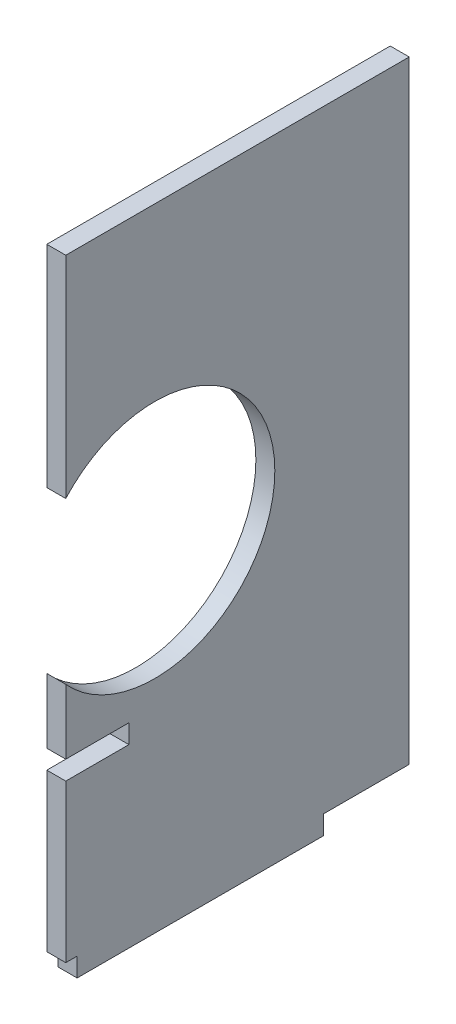
ISO-10303-21;
HEADER;
FILE_DESCRIPTION(('STEP AP214'),'2;1');
FILE_NAME('part.step','',(''),(''),'','','');
FILE_SCHEMA(('AUTOMOTIVE_DESIGN { 1 0 10303 214 1 1 1 1 }'));
ENDSEC;
DATA;
#1=APPLICATION_CONTEXT('core data for automotive mechanical design processes');
#2=APPLICATION_PROTOCOL_DEFINITION('international standard','automotive_design',2000,#1);
#3=PRODUCT_CONTEXT('',#1,'mechanical');
#4=PRODUCT('Part','Part','',(#3));
#5=PRODUCT_RELATED_PRODUCT_CATEGORY('part','',(#4));
#6=PRODUCT_DEFINITION_FORMATION('','',#4);
#7=PRODUCT_DEFINITION_CONTEXT('part definition',#1,'design');
#8=PRODUCT_DEFINITION('design','',#6,#7);
#9=PRODUCT_DEFINITION_SHAPE('','',#8);
#10=(LENGTH_UNIT() NAMED_UNIT(*) SI_UNIT(.MILLI.,.METRE.));
#11=(NAMED_UNIT(*) PLANE_ANGLE_UNIT() SI_UNIT($,.RADIAN.));
#12=(NAMED_UNIT(*) SI_UNIT($,.STERADIAN.) SOLID_ANGLE_UNIT());
#13=UNCERTAINTY_MEASURE_WITH_UNIT(LENGTH_MEASURE(1.E-05),#10,'distance_accuracy_value','');
#14=(GEOMETRIC_REPRESENTATION_CONTEXT(3) GLOBAL_UNCERTAINTY_ASSIGNED_CONTEXT((#13)) GLOBAL_UNIT_ASSIGNED_CONTEXT((#10,
#11,#12)) REPRESENTATION_CONTEXT('',''));
#15=CARTESIAN_POINT('',(0.,0.,0.));
#16=DIRECTION('',(0.,0.,1.));
#17=DIRECTION('',(1.,0.,0.));
#18=AXIS2_PLACEMENT_3D('',#15,#16,#17);
#19=CARTESIAN_POINT('',(0.,-106.426547116313,5.10565550545121));
#20=DIRECTION('',(0.,0.,-1.));
#21=DIRECTION('',(0.,1.,0.));
#22=AXIS2_PLACEMENT_3D('',#19,#20,#21);
#23=PLANE('',#22);
#24=DIRECTION('',(0.,1.,0.));
#25=VECTOR('',#24,1.);
#26=CARTESIAN_POINT('',(3.,-106.426547116313,5.10565550545121));
#27=LINE('',#26,#25);
#28=CARTESIAN_POINT('',(3.,-106.426547116313,5.10565550545121));
#29=VERTEX_POINT('',#28);
#30=CARTESIAN_POINT('',(3.,-9.42654711631268,5.10565550545122));
#31=VERTEX_POINT('',#30);
#32=EDGE_CURVE('E166',#29,#31,#27,.T.);
#33=ORIENTED_EDGE('',*,*,#32,.F.);
#34=DIRECTION('',(1.,0.,0.));
#35=VECTOR('',#34,1.);
#36=CARTESIAN_POINT('',(0.,-106.426547116313,5.10565550545121));
#37=LINE('',#36,#35);
#38=CARTESIAN_POINT('',(0.,-106.426547116313,5.10565550545121));
#39=VERTEX_POINT('',#38);
#40=EDGE_CURVE('E11',#39,#29,#37,.T.);
#41=ORIENTED_EDGE('',*,*,#40,.F.);
#42=DIRECTION('',(0.,1.,0.));
#43=VECTOR('',#42,1.);
#44=CARTESIAN_POINT('',(0.,-106.426547116313,5.10565550545121));
#45=LINE('',#44,#43);
#46=CARTESIAN_POINT('',(0.,-9.42654711631268,5.10565550545122));
#47=VERTEX_POINT('',#46);
#48=EDGE_CURVE('E204',#39,#47,#45,.T.);
#49=ORIENTED_EDGE('',*,*,#48,.T.);
#50=DIRECTION('',(1.,0.,0.));
#51=VECTOR('',#50,1.);
#52=CARTESIAN_POINT('',(0.,-9.42654711631268,5.10565550545122));
#53=LINE('',#52,#51);
#54=EDGE_CURVE('E36',#47,#31,#53,.T.);
#55=ORIENTED_EDGE('',*,*,#54,.T.);
#56=EDGE_LOOP('',(#33,#41,#49,#55));
#57=FACE_BOUND('',#56,.T.);
#58=ADVANCED_FACE('F33',(#57),#23,.T.);
#59=CARTESIAN_POINT('',(0.,-106.426547116313,18.6756555054512));
#60=DIRECTION('',(0.,-1.,0.));
#61=DIRECTION('',(0.,0.,-1.));
#62=AXIS2_PLACEMENT_3D('',#59,#60,#61);
#63=PLANE('',#62);
#64=DIRECTION('',(0.,0.,-1.));
#65=VECTOR('',#64,1.);
#66=CARTESIAN_POINT('',(3.,-106.426547116313,18.6756555054512));
#67=LINE('',#66,#65);
#68=CARTESIAN_POINT('',(3.,-106.426547116313,18.6756555054512));
#69=VERTEX_POINT('',#68);
#70=EDGE_CURVE('E202',#69,#29,#67,.T.);
#71=ORIENTED_EDGE('',*,*,#70,.F.);
#72=DIRECTION('',(1.,0.,0.));
#73=VECTOR('',#72,1.);
#74=CARTESIAN_POINT('',(0.,-106.426547116313,18.6756555054512));
#75=LINE('',#74,#73);
#76=CARTESIAN_POINT('',(0.,-106.426547116313,18.6756555054512));
#77=VERTEX_POINT('',#76);
#78=EDGE_CURVE('E42',#77,#69,#75,.T.);
#79=ORIENTED_EDGE('',*,*,#78,.F.);
#80=DIRECTION('',(0.,0.,-1.));
#81=VECTOR('',#80,1.);
#82=CARTESIAN_POINT('',(0.,-106.426547116313,18.6756555054512));
#83=LINE('',#82,#81);
#84=EDGE_CURVE('E156',#77,#39,#83,.T.);
#85=ORIENTED_EDGE('',*,*,#84,.T.);
#86=ORIENTED_EDGE('',*,*,#40,.T.);
#87=EDGE_LOOP('',(#71,#79,#85,#86));
#88=FACE_BOUND('',#87,.T.);
#89=ADVANCED_FACE('F228',(#88),#63,.T.);
#90=CARTESIAN_POINT('',(0.,-109.426547116313,18.6756555054512));
#91=DIRECTION('',(0.,0.,-1.));
#92=DIRECTION('',(-1.,0.,0.));
#93=AXIS2_PLACEMENT_3D('',#90,#91,#92);
#94=PLANE('',#93);
#95=DIRECTION('',(0.,1.,0.));
#96=VECTOR('',#95,1.);
#97=CARTESIAN_POINT('',(3.,-109.426547116313,18.6756555054512));
#98=LINE('',#97,#96);
#99=CARTESIAN_POINT('',(3.,-109.426547116313,18.6756555054512));
#100=VERTEX_POINT('',#99);
#101=EDGE_CURVE('E143',#100,#69,#98,.T.);
#102=ORIENTED_EDGE('',*,*,#101,.F.);
#103=DIRECTION('',(1.,0.,0.));
#104=VECTOR('',#103,1.);
#105=CARTESIAN_POINT('',(0.,-109.426547116313,18.6756555054512));
#106=LINE('',#105,#104);
#107=CARTESIAN_POINT('',(0.,-109.426547116313,18.6756555054512));
#108=VERTEX_POINT('',#107);
#109=EDGE_CURVE('E138',#108,#100,#106,.T.);
#110=ORIENTED_EDGE('',*,*,#109,.F.);
#111=DIRECTION('',(0.,1.,0.));
#112=VECTOR('',#111,1.);
#113=CARTESIAN_POINT('',(0.,-109.426547116313,18.6756555054512));
#114=LINE('',#113,#112);
#115=EDGE_CURVE('E141',#108,#77,#114,.T.);
#116=ORIENTED_EDGE('',*,*,#115,.T.);
#117=ORIENTED_EDGE('',*,*,#78,.T.);
#118=EDGE_LOOP('',(#102,#110,#116,#117));
#119=FACE_BOUND('',#118,.T.);
#120=ADVANCED_FACE('F140',(#119),#94,.T.);
#121=CARTESIAN_POINT('',(0.,-109.426547116313,57.6756555054512));
#122=DIRECTION('',(0.,-1.,0.));
#123=DIRECTION('',(0.,0.,-1.));
#124=AXIS2_PLACEMENT_3D('',#121,#122,#123);
#125=PLANE('',#124);
#126=DIRECTION('',(0.,0.,-1.));
#127=VECTOR('',#126,1.);
#128=CARTESIAN_POINT('',(3.,-109.426547116313,57.6756555054512));
#129=LINE('',#128,#127);
#130=CARTESIAN_POINT('',(3.,-109.426547116313,57.6756555054512));
#131=VERTEX_POINT('',#130);
#132=EDGE_CURVE('E199',#131,#100,#129,.T.);
#133=ORIENTED_EDGE('',*,*,#132,.F.);
#134=DIRECTION('',(1.,0.,0.));
#135=VECTOR('',#134,1.);
#136=CARTESIAN_POINT('',(0.,-109.426547116313,57.6756555054512));
#137=LINE('',#136,#135);
#138=CARTESIAN_POINT('',(0.,-109.426547116313,57.6756555054512));
#139=VERTEX_POINT('',#138);
#140=EDGE_CURVE('E148',#139,#131,#137,.T.);
#141=ORIENTED_EDGE('',*,*,#140,.F.);
#142=DIRECTION('',(0.,0.,-1.));
#143=VECTOR('',#142,1.);
#144=CARTESIAN_POINT('',(0.,-109.426547116313,57.6756555054512));
#145=LINE('',#144,#143);
#146=EDGE_CURVE('E154',#139,#108,#145,.T.);
#147=ORIENTED_EDGE('',*,*,#146,.T.);
#148=ORIENTED_EDGE('',*,*,#109,.T.);
#149=EDGE_LOOP('',(#133,#141,#147,#148));
#150=FACE_BOUND('',#149,.T.);
#151=ADVANCED_FACE('F158',(#150),#125,.T.);
#152=CARTESIAN_POINT('',(0.,-106.426547116313,57.6756555054512));
#153=DIRECTION('',(0.,0.,1.));
#154=DIRECTION('',(1.,0.,0.));
#155=AXIS2_PLACEMENT_3D('',#152,#153,#154);
#156=PLANE('',#155);
#157=DIRECTION('',(0.,-1.,0.));
#158=VECTOR('',#157,1.);
#159=CARTESIAN_POINT('',(3.,-106.426547116313,57.6756555054512));
#160=LINE('',#159,#158);
#161=CARTESIAN_POINT('',(3.,-106.426547116313,57.6756555054512));
#162=VERTEX_POINT('',#161);
#163=EDGE_CURVE('E196',#162,#131,#160,.T.);
#164=ORIENTED_EDGE('',*,*,#163,.F.);
#165=DIRECTION('',(1.,0.,0.));
#166=VECTOR('',#165,1.);
#167=CARTESIAN_POINT('',(0.,-106.426547116313,57.6756555054512));
#168=LINE('',#167,#166);
#169=CARTESIAN_POINT('',(0.,-106.426547116313,57.6756555054512));
#170=VERTEX_POINT('',#169);
#171=EDGE_CURVE('E208',#170,#162,#168,.T.);
#172=ORIENTED_EDGE('',*,*,#171,.F.);
#173=DIRECTION('',(0.,-1.,0.));
#174=VECTOR('',#173,1.);
#175=CARTESIAN_POINT('',(0.,-106.426547116313,57.6756555054512));
#176=LINE('',#175,#174);
#177=EDGE_CURVE('E159',#170,#139,#176,.T.);
#178=ORIENTED_EDGE('',*,*,#177,.T.);
#179=ORIENTED_EDGE('',*,*,#140,.T.);
#180=EDGE_LOOP('',(#164,#172,#178,#179));
#181=FACE_BOUND('',#180,.T.);
#182=ADVANCED_FACE('F241',(#181),#156,.T.);
#183=CARTESIAN_POINT('',(0.,-106.426547116313,59.4756555054512));
#184=DIRECTION('',(0.,-1.,0.));
#185=DIRECTION('',(0.,0.,-1.));
#186=AXIS2_PLACEMENT_3D('',#183,#184,#185);
#187=PLANE('',#186);
#188=DIRECTION('',(0.,0.,-1.));
#189=VECTOR('',#188,1.);
#190=CARTESIAN_POINT('',(3.,-106.426547116313,59.4756555054512));
#191=LINE('',#190,#189);
#192=CARTESIAN_POINT('',(3.,-106.426547116313,59.4756555054512));
#193=VERTEX_POINT('',#192);
#194=EDGE_CURVE('E193',#193,#162,#191,.T.);
#195=ORIENTED_EDGE('',*,*,#194,.F.);
#196=DIRECTION('',(1.,0.,0.));
#197=VECTOR('',#196,1.);
#198=CARTESIAN_POINT('',(0.,-106.426547116313,59.4756555054512));
#199=LINE('',#198,#197);
#200=CARTESIAN_POINT('',(0.,-106.426547116313,59.4756555054512));
#201=VERTEX_POINT('',#200);
#202=EDGE_CURVE('E210',#201,#193,#199,.T.);
#203=ORIENTED_EDGE('',*,*,#202,.F.);
#204=DIRECTION('',(0.,0.,-1.));
#205=VECTOR('',#204,1.);
#206=CARTESIAN_POINT('',(0.,-106.426547116313,59.4756555054512));
#207=LINE('',#206,#205);
#208=EDGE_CURVE('E161',#201,#170,#207,.T.);
#209=ORIENTED_EDGE('',*,*,#208,.T.);
#210=ORIENTED_EDGE('',*,*,#171,.T.);
#211=EDGE_LOOP('',(#195,#203,#209,#210));
#212=FACE_BOUND('',#211,.T.);
#213=ADVANCED_FACE('F244',(#212),#187,.T.);
#214=CARTESIAN_POINT('',(0.,-81.5265471163127,59.4756555054512));
#215=DIRECTION('',(0.,0.,1.));
#216=DIRECTION('',(0.,-1.,0.));
#217=AXIS2_PLACEMENT_3D('',#214,#215,#216);
#218=PLANE('',#217);
#219=DIRECTION('',(0.,-1.,0.));
#220=VECTOR('',#219,1.);
#221=CARTESIAN_POINT('',(3.,-81.5265471163127,59.4756555054512));
#222=LINE('',#221,#220);
#223=CARTESIAN_POINT('',(3.,-81.5265471163127,59.4756555054512));
#224=VERTEX_POINT('',#223);
#225=EDGE_CURVE('E190',#224,#193,#222,.T.);
#226=ORIENTED_EDGE('',*,*,#225,.F.);
#227=DIRECTION('',(1.,0.,0.));
#228=VECTOR('',#227,1.);
#229=CARTESIAN_POINT('',(0.,-81.5265471163127,59.4756555054512));
#230=LINE('',#229,#228);
#231=CARTESIAN_POINT('',(0.,-81.5265471163127,59.4756555054512));
#232=VERTEX_POINT('',#231);
#233=EDGE_CURVE('E212',#232,#224,#230,.T.);
#234=ORIENTED_EDGE('',*,*,#233,.F.);
#235=DIRECTION('',(0.,-1.,0.));
#236=VECTOR('',#235,1.);
#237=CARTESIAN_POINT('',(0.,-81.5265471163127,59.4756555054512));
#238=LINE('',#237,#236);
#239=EDGE_CURVE('E401',#232,#201,#238,.T.);
#240=ORIENTED_EDGE('',*,*,#239,.T.);
#241=ORIENTED_EDGE('',*,*,#202,.T.);
#242=EDGE_LOOP('',(#226,#234,#240,#241));
#243=FACE_BOUND('',#242,.T.);
#244=ADVANCED_FACE('F248',(#243),#218,.T.);
#245=CARTESIAN_POINT('',(0.,-81.5265471163127,49.4756555054512));
#246=DIRECTION('',(0.,1.,0.));
#247=DIRECTION('',(0.,0.,1.));
#248=AXIS2_PLACEMENT_3D('',#245,#246,#247);
#249=PLANE('',#248);
#250=DIRECTION('',(0.,0.,1.));
#251=VECTOR('',#250,1.);
#252=CARTESIAN_POINT('',(3.,-81.5265471163127,49.4756555054512));
#253=LINE('',#252,#251);
#254=CARTESIAN_POINT('',(3.,-81.5265471163127,49.4756555054512));
#255=VERTEX_POINT('',#254);
#256=EDGE_CURVE('E187',#255,#224,#253,.T.);
#257=ORIENTED_EDGE('',*,*,#256,.F.);
#258=DIRECTION('',(1.,0.,0.));
#259=VECTOR('',#258,1.);
#260=CARTESIAN_POINT('',(0.,-81.5265471163127,49.4756555054512));
#261=LINE('',#260,#259);
#262=CARTESIAN_POINT('',(0.,-81.5265471163127,49.4756555054512));
#263=VERTEX_POINT('',#262);
#264=EDGE_CURVE('E214',#263,#255,#261,.T.);
#265=ORIENTED_EDGE('',*,*,#264,.F.);
#266=DIRECTION('',(0.,0.,1.));
#267=VECTOR('',#266,1.);
#268=CARTESIAN_POINT('',(0.,-81.5265471163127,49.4756555054512));
#269=LINE('',#268,#267);
#270=EDGE_CURVE('E394',#263,#232,#269,.T.);
#271=ORIENTED_EDGE('',*,*,#270,.T.);
#272=ORIENTED_EDGE('',*,*,#233,.T.);
#273=EDGE_LOOP('',(#257,#265,#271,#272));
#274=FACE_BOUND('',#273,.T.);
#275=ADVANCED_FACE('F252',(#274),#249,.T.);
#276=CARTESIAN_POINT('',(0.,-78.5265471163128,49.4756555054512));
#277=DIRECTION('',(0.,0.,1.));
#278=DIRECTION('',(1.,0.,0.));
#279=AXIS2_PLACEMENT_3D('',#276,#277,#278);
#280=PLANE('',#279);
#281=DIRECTION('',(0.,-1.,0.));
#282=VECTOR('',#281,1.);
#283=CARTESIAN_POINT('',(3.,-78.5265471163128,49.4756555054512));
#284=LINE('',#283,#282);
#285=CARTESIAN_POINT('',(3.,-78.5265471163128,49.4756555054512));
#286=VERTEX_POINT('',#285);
#287=EDGE_CURVE('E184',#286,#255,#284,.T.);
#288=ORIENTED_EDGE('',*,*,#287,.F.);
#289=DIRECTION('',(1.,0.,0.));
#290=VECTOR('',#289,1.);
#291=CARTESIAN_POINT('',(0.,-78.5265471163128,49.4756555054512));
#292=LINE('',#291,#290);
#293=CARTESIAN_POINT('',(0.,-78.5265471163128,49.4756555054512));
#294=VERTEX_POINT('',#293);
#295=EDGE_CURVE('E216',#294,#286,#292,.T.);
#296=ORIENTED_EDGE('',*,*,#295,.F.);
#297=DIRECTION('',(0.,-1.,0.));
#298=VECTOR('',#297,1.);
#299=CARTESIAN_POINT('',(0.,-78.5265471163128,49.4756555054512));
#300=LINE('',#299,#298);
#301=EDGE_CURVE('E390',#294,#263,#300,.T.);
#302=ORIENTED_EDGE('',*,*,#301,.T.);
#303=ORIENTED_EDGE('',*,*,#264,.T.);
#304=EDGE_LOOP('',(#288,#296,#302,#303));
#305=FACE_BOUND('',#304,.T.);
#306=ADVANCED_FACE('F256',(#305),#280,.T.);
#307=CARTESIAN_POINT('',(0.,-78.5265471163127,59.4756555054512));
#308=DIRECTION('',(0.,-1.,0.));
#309=DIRECTION('',(0.,0.,-1.));
#310=AXIS2_PLACEMENT_3D('',#307,#308,#309);
#311=PLANE('',#310);
#312=DIRECTION('',(0.,0.,-1.));
#313=VECTOR('',#312,1.);
#314=CARTESIAN_POINT('',(3.,-78.5265471163127,59.4756555054512));
#315=LINE('',#314,#313);
#316=CARTESIAN_POINT('',(3.,-78.5265471163127,59.4756555054512));
#317=VERTEX_POINT('',#316);
#318=EDGE_CURVE('E181',#317,#286,#315,.T.);
#319=ORIENTED_EDGE('',*,*,#318,.F.);
#320=DIRECTION('',(1.,0.,0.));
#321=VECTOR('',#320,1.);
#322=CARTESIAN_POINT('',(0.,-78.5265471163127,59.4756555054512));
#323=LINE('',#322,#321);
#324=CARTESIAN_POINT('',(0.,-78.5265471163127,59.4756555054512));
#325=VERTEX_POINT('',#324);
#326=EDGE_CURVE('E218',#325,#317,#323,.T.);
#327=ORIENTED_EDGE('',*,*,#326,.F.);
#328=DIRECTION('',(0.,0.,-1.));
#329=VECTOR('',#328,1.);
#330=CARTESIAN_POINT('',(0.,-78.5265471163127,59.4756555054512));
#331=LINE('',#330,#329);
#332=EDGE_CURVE('E406',#325,#294,#331,.T.);
#333=ORIENTED_EDGE('',*,*,#332,.T.);
#334=ORIENTED_EDGE('',*,*,#295,.T.);
#335=EDGE_LOOP('',(#319,#327,#333,#334));
#336=FACE_BOUND('',#335,.T.);
#337=ADVANCED_FACE('F260',(#336),#311,.T.);
#338=CARTESIAN_POINT('',(0.,-68.2642863191697,59.4756555054512));
#339=DIRECTION('',(0.,0.,1.));
#340=DIRECTION('',(0.,-1.,0.));
#341=AXIS2_PLACEMENT_3D('',#338,#339,#340);
#342=PLANE('',#341);
#343=DIRECTION('',(0.,-1.,0.));
#344=VECTOR('',#343,1.);
#345=CARTESIAN_POINT('',(3.,-68.2642863191697,59.4756555054512));
#346=LINE('',#345,#344);
#347=CARTESIAN_POINT('',(3.,-68.2642863191697,59.4756555054512));
#348=VERTEX_POINT('',#347);
#349=EDGE_CURVE('E178',#348,#317,#346,.T.);
#350=ORIENTED_EDGE('',*,*,#349,.F.);
#351=DIRECTION('',(1.,0.,0.));
#352=VECTOR('',#351,1.);
#353=CARTESIAN_POINT('',(0.,-68.2642863191697,59.4756555054512));
#354=LINE('',#353,#352);
#355=CARTESIAN_POINT('',(0.,-68.2642863191697,59.4756555054512));
#356=VERTEX_POINT('',#355);
#357=EDGE_CURVE('E220',#356,#348,#354,.T.);
#358=ORIENTED_EDGE('',*,*,#357,.F.);
#359=DIRECTION('',(0.,-1.,0.));
#360=VECTOR('',#359,1.);
#361=CARTESIAN_POINT('',(0.,-68.2642863191697,59.4756555054512));
#362=LINE('',#361,#360);
#363=EDGE_CURVE('E383',#356,#325,#362,.T.);
#364=ORIENTED_EDGE('',*,*,#363,.T.);
#365=ORIENTED_EDGE('',*,*,#326,.T.);
#366=EDGE_LOOP('',(#350,#358,#364,#365));
#367=FACE_BOUND('',#366,.T.);
#368=ADVANCED_FACE('F264',(#367),#342,.T.);
#369=CARTESIAN_POINT('',(0.,-55.5265471163127,45.3777833255795));
#370=DIRECTION('',(1.,0.,0.));
#371=DIRECTION('',(0.,0.,-1.));
#372=AXIS2_PLACEMENT_3D('',#369,#370,#371);
#373=CYLINDRICAL_SURFACE('',#372,19.);
#374=CARTESIAN_POINT('',(3.,-55.5265471163127,45.3777833255795));
#375=DIRECTION('',(-1.,0.,0.));
#376=DIRECTION('',(0.,0.,1.));
#377=AXIS2_PLACEMENT_3D('',#374,#375,#376);
#378=CIRCLE('',#377,19.);
#379=CARTESIAN_POINT('',(3.,-42.7888079134557,59.4756555054512));
#380=VERTEX_POINT('',#379);
#381=EDGE_CURVE('E175',#380,#348,#378,.T.);
#382=ORIENTED_EDGE('',*,*,#381,.F.);
#383=DIRECTION('',(1.,0.,0.));
#384=VECTOR('',#383,1.);
#385=CARTESIAN_POINT('',(0.,-42.7888079134557,59.4756555054512));
#386=LINE('',#385,#384);
#387=CARTESIAN_POINT('',(0.,-42.7888079134557,59.4756555054512));
#388=VERTEX_POINT('',#387);
#389=EDGE_CURVE('E222',#388,#380,#386,.T.);
#390=ORIENTED_EDGE('',*,*,#389,.F.);
#391=CARTESIAN_POINT('',(0.,-55.5265471163127,45.3777833255795));
#392=DIRECTION('',(-1.,0.,0.));
#393=DIRECTION('',(0.,0.,1.));
#394=AXIS2_PLACEMENT_3D('',#391,#392,#393);
#395=CIRCLE('',#394,19.);
#396=EDGE_CURVE('E379',#388,#356,#395,.T.);
#397=ORIENTED_EDGE('',*,*,#396,.T.);
#398=ORIENTED_EDGE('',*,*,#357,.T.);
#399=EDGE_LOOP('',(#382,#390,#397,#398));
#400=FACE_BOUND('',#399,.T.);
#401=ADVANCED_FACE('F268',(#400),#373,.F.);
#402=CARTESIAN_POINT('',(0.,-9.42654711631269,59.4756555054512));
#403=DIRECTION('',(0.,0.,1.));
#404=DIRECTION('',(0.,-1.,0.));
#405=AXIS2_PLACEMENT_3D('',#402,#403,#404);
#406=PLANE('',#405);
#407=DIRECTION('',(0.,-1.,0.));
#408=VECTOR('',#407,1.);
#409=CARTESIAN_POINT('',(3.,-9.42654711631269,59.4756555054512));
#410=LINE('',#409,#408);
#411=CARTESIAN_POINT('',(3.,-9.42654711631269,59.4756555054512));
#412=VERTEX_POINT('',#411);
#413=EDGE_CURVE('E172',#412,#380,#410,.T.);
#414=ORIENTED_EDGE('',*,*,#413,.F.);
#415=DIRECTION('',(1.,0.,0.));
#416=VECTOR('',#415,1.);
#417=CARTESIAN_POINT('',(0.,-9.42654711631269,59.4756555054512));
#418=LINE('',#417,#416);
#419=CARTESIAN_POINT('',(0.,-9.42654711631269,59.4756555054512));
#420=VERTEX_POINT('',#419);
#421=EDGE_CURVE('E223',#420,#412,#418,.T.);
#422=ORIENTED_EDGE('',*,*,#421,.F.);
#423=DIRECTION('',(0.,-1.,0.));
#424=VECTOR('',#423,1.);
#425=CARTESIAN_POINT('',(0.,-9.42654711631269,59.4756555054512));
#426=LINE('',#425,#424);
#427=EDGE_CURVE('E410',#420,#388,#426,.T.);
#428=ORIENTED_EDGE('',*,*,#427,.T.);
#429=ORIENTED_EDGE('',*,*,#389,.T.);
#430=EDGE_LOOP('',(#414,#422,#428,#429));
#431=FACE_BOUND('',#430,.T.);
#432=ADVANCED_FACE('F272',(#431),#406,.T.);
#433=CARTESIAN_POINT('',(0.,-9.42654711631268,5.10565550545122));
#434=DIRECTION('',(0.,1.,0.));
#435=DIRECTION('',(0.,0.,1.));
#436=AXIS2_PLACEMENT_3D('',#433,#434,#435);
#437=PLANE('',#436);
#438=DIRECTION('',(0.,0.,1.));
#439=VECTOR('',#438,1.);
#440=CARTESIAN_POINT('',(3.,-9.42654711631268,5.10565550545122));
#441=LINE('',#440,#439);
#442=EDGE_CURVE('E169',#31,#412,#441,.T.);
#443=ORIENTED_EDGE('',*,*,#442,.F.);
#444=ORIENTED_EDGE('',*,*,#54,.F.);
#445=DIRECTION('',(0.,0.,1.));
#446=VECTOR('',#445,1.);
#447=CARTESIAN_POINT('',(0.,-9.42654711631268,5.10565550545122));
#448=LINE('',#447,#446);
#449=EDGE_CURVE('E412',#47,#420,#448,.T.);
#450=ORIENTED_EDGE('',*,*,#449,.T.);
#451=ORIENTED_EDGE('',*,*,#421,.T.);
#452=EDGE_LOOP('',(#443,#444,#450,#451));
#453=FACE_BOUND('',#452,.T.);
#454=ADVANCED_FACE('F225',(#453),#437,.T.);
#455=CARTESIAN_POINT('',(0.,-55.5265471163127,45.3777833255795));
#456=DIRECTION('',(-1.,0.,0.));
#457=DIRECTION('',(0.,0.,1.));
#458=AXIS2_PLACEMENT_3D('',#455,#456,#457);
#459=PLANE('',#458);
#460=ORIENTED_EDGE('',*,*,#48,.F.);
#461=ORIENTED_EDGE('',*,*,#84,.F.);
#462=ORIENTED_EDGE('',*,*,#115,.F.);
#463=ORIENTED_EDGE('',*,*,#146,.F.);
#464=ORIENTED_EDGE('',*,*,#177,.F.);
#465=ORIENTED_EDGE('',*,*,#208,.F.);
#466=ORIENTED_EDGE('',*,*,#239,.F.);
#467=ORIENTED_EDGE('',*,*,#270,.F.);
#468=ORIENTED_EDGE('',*,*,#301,.F.);
#469=ORIENTED_EDGE('',*,*,#332,.F.);
#470=ORIENTED_EDGE('',*,*,#363,.F.);
#471=ORIENTED_EDGE('',*,*,#396,.F.);
#472=ORIENTED_EDGE('',*,*,#427,.F.);
#473=ORIENTED_EDGE('',*,*,#449,.F.);
#474=EDGE_LOOP('',(#460,#461,#462,#463,#464,#465,#466,#467,#468,#469,#470,#471,#472,#473));
#475=FACE_BOUND('',#474,.T.);
#476=ADVANCED_FACE('F152',(#475),#459,.T.);
#477=CARTESIAN_POINT('',(3.,-55.5265471163127,45.3777833255795));
#478=DIRECTION('',(-1.,0.,0.));
#479=DIRECTION('',(0.,0.,1.));
#480=AXIS2_PLACEMENT_3D('',#477,#478,#479);
#481=PLANE('',#480);
#482=ORIENTED_EDGE('',*,*,#32,.T.);
#483=ORIENTED_EDGE('',*,*,#442,.T.);
#484=ORIENTED_EDGE('',*,*,#413,.T.);
#485=ORIENTED_EDGE('',*,*,#381,.T.);
#486=ORIENTED_EDGE('',*,*,#349,.T.);
#487=ORIENTED_EDGE('',*,*,#318,.T.);
#488=ORIENTED_EDGE('',*,*,#287,.T.);
#489=ORIENTED_EDGE('',*,*,#256,.T.);
#490=ORIENTED_EDGE('',*,*,#225,.T.);
#491=ORIENTED_EDGE('',*,*,#194,.T.);
#492=ORIENTED_EDGE('',*,*,#163,.T.);
#493=ORIENTED_EDGE('',*,*,#132,.T.);
#494=ORIENTED_EDGE('',*,*,#101,.T.);
#495=ORIENTED_EDGE('',*,*,#70,.T.);
#496=EDGE_LOOP('',(#482,#483,#484,#485,#486,#487,#488,#489,#490,#491,#492,#493,#494,#495));
#497=FACE_BOUND('',#496,.T.);
#498=ADVANCED_FACE('F227',(#497),#481,.F.);
#499=CLOSED_SHELL('',(#58,#89,#120,#151,#182,#213,#244,#275,#306,#337,#368,#401,#432,#454,#476,#498));
#500=MANIFOLD_SOLID_BREP('B2',#499);
#501=ADVANCED_BREP_SHAPE_REPRESENTATION('',(#18,#500),#14);
#502=SHAPE_DEFINITION_REPRESENTATION(#9,#501);
ENDSEC;
END-ISO-10303-21;
